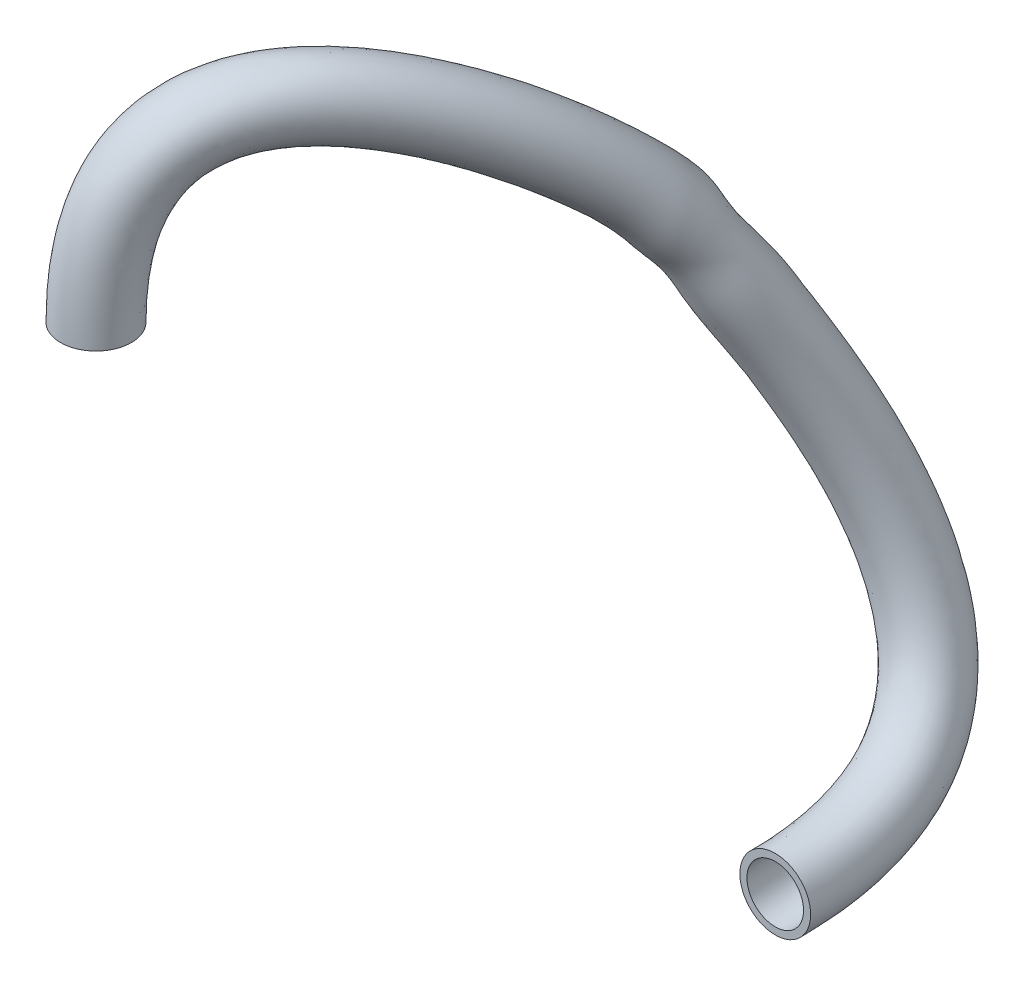
ISO-10303-21;
HEADER;
FILE_DESCRIPTION(('STEP AP214'),'2;1');
FILE_NAME('part.step','',(''),(''),'','','');
FILE_SCHEMA(('AUTOMOTIVE_DESIGN { 1 0 10303 214 1 1 1 1 }'));
ENDSEC;
DATA;
#1=APPLICATION_CONTEXT('core data for automotive mechanical design processes');
#2=APPLICATION_PROTOCOL_DEFINITION('international standard','automotive_design',2000,#1);
#3=PRODUCT_CONTEXT('',#1,'mechanical');
#4=PRODUCT('Part','Part','',(#3));
#5=PRODUCT_RELATED_PRODUCT_CATEGORY('part','',(#4));
#6=PRODUCT_DEFINITION_FORMATION('','',#4);
#7=PRODUCT_DEFINITION_CONTEXT('part definition',#1,'design');
#8=PRODUCT_DEFINITION('design','',#6,#7);
#9=PRODUCT_DEFINITION_SHAPE('','',#8);
#10=(LENGTH_UNIT() NAMED_UNIT(*) SI_UNIT(.MILLI.,.METRE.));
#11=(NAMED_UNIT(*) PLANE_ANGLE_UNIT() SI_UNIT($,.RADIAN.));
#12=(NAMED_UNIT(*) SI_UNIT($,.STERADIAN.) SOLID_ANGLE_UNIT());
#13=UNCERTAINTY_MEASURE_WITH_UNIT(LENGTH_MEASURE(1.E-05),#10,'distance_accuracy_value','');
#14=(GEOMETRIC_REPRESENTATION_CONTEXT(3) GLOBAL_UNCERTAINTY_ASSIGNED_CONTEXT((#13)) GLOBAL_UNIT_ASSIGNED_CONTEXT((#10,
#11,#12)) REPRESENTATION_CONTEXT('',''));
#15=CARTESIAN_POINT('',(0.,0.,0.));
#16=DIRECTION('',(0.,0.,1.));
#17=DIRECTION('',(1.,0.,0.));
#18=AXIS2_PLACEMENT_3D('',#15,#16,#17);
#19=CARTESIAN_POINT('',(14.,-15.5,-9.99999999999995));
#20=DIRECTION('',(0.,0.,1.));
#21=DIRECTION('',(0.789083973003647,-0.614285343752218,0.));
#22=AXIS2_PLACEMENT_3D('',#19,#20,#21);
#23=PLANE('',#22);
#24=CARTESIAN_POINT('',(14.,-15.5,-9.99999999999995));
#25=DIRECTION('',(0.,0.,1.));
#26=DIRECTION('',(0.789083973003647,-0.614285343752218,0.));
#27=AXIS2_PLACEMENT_3D('',#24,#25,#26);
#28=CIRCLE('',#27,1.);
#29=CARTESIAN_POINT('',(14.7890839730036,-16.1142853437522,-9.99999999999994));
#30=VERTEX_POINT('',#29);
#31=EDGE_CURVE('E397',#30,#30,#28,.T.);
#32=ORIENTED_EDGE('',*,*,#31,.F.);
#33=EDGE_LOOP('',(#32));
#34=FACE_BOUND('',#33,.T.);
#35=CARTESIAN_POINT('',(14.,-15.5,-9.99999999999995));
#36=DIRECTION('',(0.,0.,1.));
#37=DIRECTION('',(0.789083973003647,-0.614285343752218,0.));
#38=AXIS2_PLACEMENT_3D('',#35,#36,#37);
#39=CIRCLE('',#38,1.25);
#40=CARTESIAN_POINT('',(14.9863549662545,-16.2678566796903,-9.99999999999994));
#41=VERTEX_POINT('',#40);
#42=EDGE_CURVE('E12',#41,#41,#39,.T.);
#43=ORIENTED_EDGE('',*,*,#42,.T.);
#44=EDGE_LOOP('',(#43));
#45=FACE_BOUND('',#44,.T.);
#46=ADVANCED_FACE('F387',(#34,#45),#23,.T.);
#47=CARTESIAN_POINT('',(0.,0.,0.));
#48=DIRECTION('',(0.,1.,0.));
#49=DIRECTION('',(0.,0.,1.));
#50=AXIS2_PLACEMENT_3D('',#47,#48,#49);
#51=PLANE('',#50);
#52=CARTESIAN_POINT('',(0.,0.,0.));
#53=DIRECTION('',(0.,1.,0.));
#54=DIRECTION('',(0.,0.,1.));
#55=AXIS2_PLACEMENT_3D('',#52,#53,#54);
#56=CIRCLE('',#55,1.);
#57=CARTESIAN_POINT('',(0.,0.,1.));
#58=VERTEX_POINT('',#57);
#59=EDGE_CURVE('E416',#58,#58,#56,.T.);
#60=ORIENTED_EDGE('',*,*,#59,.T.);
#61=EDGE_LOOP('',(#60));
#62=FACE_BOUND('',#61,.T.);
#63=CARTESIAN_POINT('',(0.,0.,0.));
#64=DIRECTION('',(0.,1.,0.));
#65=DIRECTION('',(0.,0.,1.));
#66=AXIS2_PLACEMENT_3D('',#63,#64,#65);
#67=CIRCLE('',#66,1.25);
#68=CARTESIAN_POINT('',(0.,0.,1.25));
#69=VERTEX_POINT('',#68);
#70=EDGE_CURVE('E420',#69,#69,#67,.T.);
#71=ORIENTED_EDGE('',*,*,#70,.F.);
#72=EDGE_LOOP('',(#71));
#73=FACE_BOUND('',#72,.T.);
#74=ADVANCED_FACE('F432',(#62,#73),#51,.F.);
#75=CARTESIAN_POINT('',(0.,0.,1.25));
#76=CARTESIAN_POINT('',(0.000443159797817283,0.600432614982434,1.24900960001782));
#77=CARTESIAN_POINT('',(0.0311438299072186,1.70824203480459,1.19527922970763));
#78=CARTESIAN_POINT('',(0.172108050697637,3.15001153602846,0.950047574269966));
#79=CARTESIAN_POINT('',(0.387865478221217,4.2771495488151,0.575264200533966));
#80=CARTESIAN_POINT('',(0.65473647429474,5.14867232651583,0.112071346721281));
#81=CARTESIAN_POINT('',(0.947192517956339,5.80559858182057,-0.395256930318224));
#82=CARTESIAN_POINT('',(1.28423247697856,6.32445185948775,-0.979659325308274));
#83=CARTESIAN_POINT('',(1.77693727554934,6.82713809198644,-1.833655684593));
#84=CARTESIAN_POINT('',(2.44043443387204,7.11869980432711,-2.98305764842713));
#85=CARTESIAN_POINT('',(3.25559449789904,7.06206211016763,-4.39493210630585));
#86=CARTESIAN_POINT('',(4.074153277781,6.71295581559429,-5.81133675757498));
#87=CARTESIAN_POINT('',(5.21386823932525,5.91552908532776,-7.79081468461486));
#88=CARTESIAN_POINT('',(6.62441283422166,4.43784721036875,-10.1969261045626));
#89=CARTESIAN_POINT('',(7.44977058523145,3.15429014822095,-11.7844069540515));
#90=CARTESIAN_POINT('',(8.16477577719259,2.05687583284689,-12.8753265309124));
#91=CARTESIAN_POINT('',(8.59787514451698,1.36132699933438,-13.373649716726));
#92=CARTESIAN_POINT('',(8.37636995382083,0.370275762379769,-14.2718001755615));
#93=CARTESIAN_POINT('',(8.27905558322766,-0.972530647124541,-15.3682116993445));
#94=CARTESIAN_POINT('',(9.82371979772082,-3.18924197608111,-16.2542848622035));
#95=CARTESIAN_POINT('',(10.7839132195536,-5.97221141947634,-17.4402366823719));
#96=CARTESIAN_POINT('',(11.7491475828968,-8.290393669503,-17.9960993735494));
#97=CARTESIAN_POINT('',(12.4654845221077,-10.068813081878,-18.1754493505048));
#98=CARTESIAN_POINT('',(13.0701186004497,-11.5560016181267,-18.0193147739162));
#99=CARTESIAN_POINT('',(13.5490318024737,-12.736076883405,-17.6147652043025));
#100=CARTESIAN_POINT('',(13.9084304398311,-13.6207299344259,-17.1070974446474));
#101=CARTESIAN_POINT('',(14.2314354189671,-14.4153874385595,-16.3995861882586));
#102=CARTESIAN_POINT('',(14.5042996756602,-15.0861383922094,-15.4945219768148));
#103=CARTESIAN_POINT('',(14.7187059968212,-15.612702942376,-14.4040934545537));
#104=CARTESIAN_POINT('',(14.8722505107489,-15.9893254782395,-13.1356568613964));
#105=CARTESIAN_POINT('',(14.9653099183771,-16.2170975925243,-11.6825325410541));
#106=CARTESIAN_POINT('',(14.9859255166746,-16.2671126919445,-10.58685250763));
#107=CARTESIAN_POINT('',(14.9863549662546,-16.2678566796903,-9.99999999999992));
#108=CARTESIAN_POINT('',(-2.5,0.,1.25));
#109=CARTESIAN_POINT('',(-2.49889937425142,0.647989125137163,1.24761359768785));
#110=CARTESIAN_POINT('',(-2.4668837722405,1.85091156526878,1.19109122271773));
#111=CARTESIAN_POINT('',(-2.30844009070488,3.48309620995854,0.91475390825515));
#112=CARTESIAN_POINT('',(-2.05455331666513,4.81810933820954,0.473112173350324));
#113=CARTESIAN_POINT('',(-1.72655610028666,5.89203332739887,-0.0967423924698728));
#114=CARTESIAN_POINT('',(-1.35743439539171,6.72214911622659,-0.73759541636114));
#115=CARTESIAN_POINT('',(-0.927062225836374,7.38435792485332,-1.48441349372848));
#116=CARTESIAN_POINT('',(-0.301111082320269,8.0211143985897,-2.57026974025606));
#117=CARTESIAN_POINT('',(0.516383262294226,8.37223407003032,-3.98799802000307));
#118=CARTESIAN_POINT('',(1.46128809312117,8.29729094540743,-5.62759986732182));
#119=CARTESIAN_POINT('',(2.36709082972953,7.902727284087,-7.20055175718432));
#120=CARTESIAN_POINT('',(3.58662056870041,7.02772943455003,-9.32980582876691));
#121=CARTESIAN_POINT('',(5.06058079345582,5.46278752988492,-11.8877088470656));
#122=CARTESIAN_POINT('',(5.83686255106693,4.01094040536335,-13.4344947800626));
#123=CARTESIAN_POINT('',(6.62101991585282,2.82117785019294,-14.7547364329108));
#124=CARTESIAN_POINT('',(7.15889812996085,2.07825567469364,-15.554358975196));
#125=CARTESIAN_POINT('',(6.38112861261878,0.264778695834172,-15.4919630148561));
#126=CARTESIAN_POINT('',(5.6858142347917,-1.88023604397857,-15.5640533410813));
#127=CARTESIAN_POINT('',(7.70728695017192,-3.38612243001059,-17.5947248010407));
#128=CARTESIAN_POINT('',(8.6060654349124,-6.4640610293508,-18.5718670431698));
#129=CARTESIAN_POINT('',(9.65826823176036,-8.90782078825622,-19.2227108235649));
#130=CARTESIAN_POINT('',(10.4466964659898,-10.8699358023006,-19.4208861223505));
#131=CARTESIAN_POINT('',(11.1453289562584,-12.5812536434253,-19.251708987618));
#132=CARTESIAN_POINT('',(11.7202301964145,-13.995986247747,-18.7704193952943));
#133=CARTESIAN_POINT('',(12.1612584565046,-15.0800573366071,-18.1507842583149));
#134=CARTESIAN_POINT('',(12.5605472166317,-16.0612370881549,-17.2782654641548));
#135=CARTESIAN_POINT('',(12.8937637320378,-16.8792906678598,-16.1733483735124));
#136=CARTESIAN_POINT('',(13.1482988330897,-17.5034133983972,-14.8776264198416));
#137=CARTESIAN_POINT('',(13.3242637842605,-17.9340436679777,-13.4223217799363));
#138=CARTESIAN_POINT('',(13.4277590014835,-18.1863683261242,-11.808434402019));
#139=CARTESIAN_POINT('',(13.449599638123,-18.2386762248172,-10.6288197946183));
#140=CARTESIAN_POINT('',(13.450641606874,-18.2405666121994,-9.99999999999991));
#141=CARTESIAN_POINT('',(-2.5,0.,-1.25));
#142=CARTESIAN_POINT('',(-2.49978569384706,0.56542843298809,-1.25040560234779));
#143=CARTESIAN_POINT('',(-2.4695427310274,1.60322948882155,-1.3029663773892));
#144=CARTESIAN_POINT('',(-2.34066940332165,2.90460339553119,-1.5266464567897));
#145=CARTESIAN_POINT('',(-2.15227059866531,3.87828217907819,-1.85344287890481));
#146=CARTESIAN_POINT('',(-1.92976258548091,4.60015332830115,-2.23921671809532));
#147=CARTESIAN_POINT('',(-1.69319099405263,5.12874336635376,-2.64920641235525));
#148=CARTESIAN_POINT('',(-1.42434009872335,5.54090503045819,-3.1149444540686));
#149=CARTESIAN_POINT('',(-1.02910852575782,5.94281090163018,-3.79930007873528));
#150=CARTESIAN_POINT('',(-0.478443258830474,6.1867877790496,-4.75223231803015));
#151=CARTESIAN_POINT('',(0.241321709147487,6.13601676400761,-5.99602544699452));
#152=CARTESIAN_POINT('',(0.99426677895588,5.80947705784494,-7.29694127108048));
#153=CARTESIAN_POINT('',(2.07273591904288,5.03888698114728,-9.1495933141251));
#154=CARTESIAN_POINT('',(3.40733165052187,3.59871494245321,-11.4945472342134));
#155=CARTESIAN_POINT('',(4.27296363027447,2.20635780883425,-12.8135467771453));
#156=CARTESIAN_POINT('',(4.82887283026031,1.19774288144875,-13.9504410592704));
#157=CARTESIAN_POINT('',(5.04320982075595,0.665076856385629,-14.6187605696505));
#158=CARTESIAN_POINT('',(5.41312277770412,-1.02666401248296,-13.7870381147185));
#159=CARTESIAN_POINT('',(5.93584457747973,-3.12299466755062,-13.1246103954002));
#160=CARTESIAN_POINT('',(6.63944540653696,-4.67025091396364,-15.7126740218722));
#161=CARTESIAN_POINT('',(7.76097997594678,-7.53054530339216,-16.4671303777481));
#162=CARTESIAN_POINT('',(8.64189719588144,-9.70622031040905,-17.0765177210036));
#163=CARTESIAN_POINT('',(9.30839861060821,-11.3576851310056,-17.2369491187045));
#164=CARTESIAN_POINT('',(9.84329769733056,-12.6785696977009,-17.1022028898235));
#165=CARTESIAN_POINT('',(10.2522142432538,-13.6875665515043,-16.7574404453483));
#166=CARTESIAN_POINT('',(10.5520093477935,-14.4266290599819,-16.3346671774815));
#167=CARTESIAN_POINT('',(10.8194398303304,-15.0854172417957,-15.750235494615));
#168=CARTESIAN_POINT('',(11.0484791151594,-15.6492201595348,-14.9934349841328));
#169=CARTESIAN_POINT('',(11.2339644994342,-16.1054947317963,-14.0548671010616));
#170=CARTESIAN_POINT('',(11.3716270316408,-16.4438924583573,-12.9244268523968));
#171=CARTESIAN_POINT('',(11.4576257664542,-16.6551188932182,-11.5898588089878));
#172=CARTESIAN_POINT('',(11.4777486047738,-16.7044508409282,-10.5559612636079));
#173=CARTESIAN_POINT('',(11.4779316743649,-16.7048532528188,-9.99999999999994));
#174=CARTESIAN_POINT('',(0.,0.,-1.25));
#175=CARTESIAN_POINT('',(-0.000443159797817134,0.517871922833361,-1.24900960001782));
#176=CARTESIAN_POINT('',(0.028484871120315,1.46055995835736,-1.2987783703993));
#177=CARTESIAN_POINT('',(0.139878738080873,2.57151872160111,-1.49135279077489));
#178=CARTESIAN_POINT('',(0.290148196221044,3.33732238968375,-1.75129085172117));
#179=CARTESIAN_POINT('',(0.451529989100484,3.85679232741811,-2.03040297890417));
#180=CARTESIAN_POINT('',(0.611435919295422,4.21219283194774,-2.30686792631234));
#181=CARTESIAN_POINT('',(0.78695460409159,4.48099896509264,-2.61019028564839));
#182=CARTESIAN_POINT('',(1.04893983211178,4.74883459502692,-3.06268602307222));
#183=CARTESIAN_POINT('',(1.44560791274734,4.9332535133464,-3.74729194645421));
#184=CARTESIAN_POINT('',(2.03562811392535,4.90078792876781,-4.76335768597856));
#185=CARTESIAN_POINT('',(2.70132922700736,4.61970558935223,-5.90772627147114));
#186=CARTESIAN_POINT('',(3.69998358966772,3.92668663192501,-7.61060216997305));
#187=CARTESIAN_POINT('',(4.97116369128772,2.57377462293705,-9.80376449171041));
#188=CARTESIAN_POINT('',(5.885871664439,1.34970755169185,-11.1634589511342));
#189=CARTESIAN_POINT('',(6.37262869160007,0.433440864102697,-12.071031157272));
#190=CARTESIAN_POINT('',(6.48218683531208,-0.0518518189736274,-12.4380513111805));
#191=CARTESIAN_POINT('',(7.40836411890617,-0.921166945937365,-12.5668752754239));
#192=CARTESIAN_POINT('',(8.52908592591569,-2.2152892706966,-12.9287687536634));
#193=CARTESIAN_POINT('',(8.75587825408587,-4.47337046003416,-14.3722340830349));
#194=CARTESIAN_POINT('',(9.93882776058795,-7.0386956935177,-15.3355000169502));
#195=CARTESIAN_POINT('',(10.7327765470179,-9.08879319165583,-15.849906270988));
#196=CARTESIAN_POINT('',(11.3271866667261,-10.556562410583,-15.9915123468589));
#197=CARTESIAN_POINT('',(11.7680873415218,-11.6533176724023,-15.8698086761218));
#198=CARTESIAN_POINT('',(12.0810158493129,-12.4276571871623,-15.6017862543565));
#199=CARTESIAN_POINT('',(12.29918133112,-12.9673016578008,-15.290980363814));
#200=CARTESIAN_POINT('',(12.4903280326657,-13.4395675922004,-14.8715562187187));
#201=CARTESIAN_POINT('',(12.6590150587817,-13.8560678838844,-14.3146085874352));
#202=CARTESIAN_POINT('',(12.8043716631658,-14.214784275775,-13.5813341357737));
#203=CARTESIAN_POINT('',(12.9196137581292,-14.4991742686191,-12.6377619338569));
#204=CARTESIAN_POINT('',(12.9951766833479,-14.6858481596183,-11.4639569480229));
#205=CARTESIAN_POINT('',(13.0140744833254,-14.7328873080555,-10.5139939766196));
#206=CARTESIAN_POINT('',(13.0136450337454,-14.7321433203097,-9.99999999999995));
#207=CARTESIAN_POINT('',(2.5,0.,-1.25));
#208=CARTESIAN_POINT('',(2.49889937425142,0.470315412678631,-1.24761359768785));
#209=CARTESIAN_POINT('',(2.52651247326803,1.31789042789317,-1.2945903634094));
#210=CARTESIAN_POINT('',(2.62042687948339,2.23843404767103,-1.45605912476007));
#211=CARTESIAN_POINT('',(2.73256699110739,2.79636260028931,-1.64913882453753));
#212=CARTESIAN_POINT('',(2.83282256368188,3.11343132653507,-1.82158923971301));
#213=CARTESIAN_POINT('',(2.91606283264347,3.29564229754171,-1.96452944026942));
#214=CARTESIAN_POINT('',(2.99824930690653,3.42109289972708,-2.10543611722819));
#215=CARTESIAN_POINT('',(3.12698818998139,3.55485828842367,-2.32607196740916));
#216=CARTESIAN_POINT('',(3.36965908432515,3.67971924764319,-2.74235157487828));
#217=CARTESIAN_POINT('',(3.82993451870322,3.66555909352801,-3.53068992496259));
#218=CARTESIAN_POINT('',(4.40839167505883,3.42993412085952,-4.51851127186179));
#219=CARTESIAN_POINT('',(5.32723126029256,2.81448628270275,-6.071611025821));
#220=CARTESIAN_POINT('',(6.53499573205356,1.54883430342088,-8.11298174920746));
#221=CARTESIAN_POINT('',(7.49877969860352,0.493057294549447,-9.51337112512315));
#222=CARTESIAN_POINT('',(7.91638455293984,-0.330861153243358,-10.1916212552735));
#223=CARTESIAN_POINT('',(7.92116384986822,-0.768780494332884,-10.2573420527105));
#224=CARTESIAN_POINT('',(9.40360546010822,-0.815669879391768,-11.3467124361293));
#225=CARTESIAN_POINT('',(11.1223272743516,-1.30758387384257,-12.7329271119266));
#226=CARTESIAN_POINT('',(10.8723111016348,-4.27649000610469,-13.0317941441977));
#227=CARTESIAN_POINT('',(12.1166755452291,-6.54684608364324,-14.2038696561523));
#228=CARTESIAN_POINT('',(12.8236558981544,-8.47136607290261,-14.6232948209725));
#229=CARTESIAN_POINT('',(13.3459747228441,-9.75543969016039,-14.7460755750133));
#230=CARTESIAN_POINT('',(13.6928769857131,-10.6280656471037,-14.63741446242));
#231=CARTESIAN_POINT('',(13.9098174553721,-11.1677478228203,-14.4461320633647));
#232=CARTESIAN_POINT('',(14.0463533144465,-11.5079742556196,-14.2472935501465));
#233=CARTESIAN_POINT('',(14.1612162350011,-11.7937179426051,-13.9928769428224));
#234=CARTESIAN_POINT('',(14.2695510024041,-12.062915608234,-13.6357821907376));
#235=CARTESIAN_POINT('',(14.3747788268973,-12.3240738197538,-13.1078011704857));
#236=CARTESIAN_POINT('',(14.4676004846176,-12.5544560788809,-12.351097015317));
#237=CARTESIAN_POINT('',(14.5327276002416,-12.7165774260183,-11.3380550870579));
#238=CARTESIAN_POINT('',(14.550400361877,-12.7613237751828,-10.4720266896313));
#239=CARTESIAN_POINT('',(14.549358393126,-12.7594333878006,-9.99999999999997));
#240=CARTESIAN_POINT('',(2.5,0.,1.25));
#241=CARTESIAN_POINT('',(2.49978569384706,0.552876104827705,1.25040560234779));
#242=CARTESIAN_POINT('',(2.52917143205494,1.5655725043404,1.19946723669754));
#243=CARTESIAN_POINT('',(2.65265619210016,2.81692686209838,0.985341240284782));
#244=CARTESIAN_POINT('',(2.83028427310757,3.73618975942066,0.677416227717608));
#245=CARTESIAN_POINT('',(3.03602904887614,4.40531132563279,0.320885085912436));
#246=CARTESIAN_POINT('',(3.25181943130439,4.88904804741455,-0.0529184442753082));
#247=CARTESIAN_POINT('',(3.4955271797935,5.2645457941222,-0.474905156888071));
#248=CARTESIAN_POINT('',(3.85498563341895,5.63316178538318,-1.09704162892993));
#249=CARTESIAN_POINT('',(4.36448560544985,5.86516553862391,-1.9781172768512));
#250=CARTESIAN_POINT('',(5.0499009026769,5.82683327492782,-3.16226434528988));
#251=CARTESIAN_POINT('',(5.78121572583248,5.52318434710158,-4.42212175796563));
#252=CARTESIAN_POINT('',(6.84111590995009,4.8033287361055,-6.25182354046281));
#253=CARTESIAN_POINT('',(8.1882448749875,3.41290689085259,-8.50614336205967));
#254=CARTESIAN_POINT('',(9.06267861939598,2.29763989107855,-10.1343191280404));
#255=CARTESIAN_POINT('',(9.70853163853235,1.29257381550083,-10.995916628914));
#256=CARTESIAN_POINT('',(10.0368521590731,0.644398323975125,-11.192940458256));
#257=CARTESIAN_POINT('',(10.3716112950229,0.475772828925366,-13.0516373362669));
#258=CARTESIAN_POINT('',(10.8722969316636,-0.0648252502705152,-15.1723700576077));
#259=CARTESIAN_POINT('',(11.9401526452697,-2.99236152215164,-14.9138449233663));
#260=CARTESIAN_POINT('',(12.9617610041947,-5.48036180960188,-16.308606321574));
#261=CARTESIAN_POINT('',(13.8400269340333,-7.67296655074978,-16.7694879235338));
#262=CARTESIAN_POINT('',(14.4842725782257,-9.26769036145542,-16.9300125786592));
#263=CARTESIAN_POINT('',(14.994908244641,-10.5307495928281,-16.7869205602145));
#264=CARTESIAN_POINT('',(15.3778334085329,-11.4761675190629,-16.4591110133106));
#265=CARTESIAN_POINT('',(15.6556024231576,-12.1614025322448,-16.0634106309799));
#266=CARTESIAN_POINT('',(15.9023236213024,-12.7695377889642,-15.5209069123623));
#267=CARTESIAN_POINT('',(16.1148356192826,-13.292986116559,-14.8156955801171));
#268=CARTESIAN_POINT('',(16.2891131605528,-13.7219924863547,-13.9305604892658));
#269=CARTESIAN_POINT('',(16.4202372372373,-14.0446072885013,-12.8489919428565));
#270=CARTESIAN_POINT('',(16.5028608352708,-14.2478268589244,-11.5566306800891));
#271=CARTESIAN_POINT('',(16.5222513952262,-14.2955491590718,-10.5448852206417));
#272=CARTESIAN_POINT('',(16.5220683256351,-14.2951467471812,-9.99999999999994));
#273=CARTESIAN_POINT('',(0.,0.,1.25));
#274=CARTESIAN_POINT('',(0.000443159797817283,0.600432614982434,1.24900960001782));
#275=CARTESIAN_POINT('',(0.0311438299072186,1.70824203480459,1.19527922970763));
#276=CARTESIAN_POINT('',(0.172108050697637,3.15001153602846,0.950047574269966));
#277=CARTESIAN_POINT('',(0.387865478221217,4.2771495488151,0.575264200533966));
#278=CARTESIAN_POINT('',(0.65473647429474,5.14867232651583,0.112071346721281));
#279=CARTESIAN_POINT('',(0.947192517956339,5.80559858182057,-0.395256930318224));
#280=CARTESIAN_POINT('',(1.28423247697856,6.32445185948775,-0.979659325308274));
#281=CARTESIAN_POINT('',(1.77693727554934,6.82713809198644,-1.833655684593));
#282=CARTESIAN_POINT('',(2.44043443387204,7.11869980432711,-2.98305764842713));
#283=CARTESIAN_POINT('',(3.25559449789904,7.06206211016763,-4.39493210630585));
#284=CARTESIAN_POINT('',(4.074153277781,6.71295581559429,-5.81133675757498));
#285=CARTESIAN_POINT('',(5.21386823932525,5.91552908532776,-7.79081468461486));
#286=CARTESIAN_POINT('',(6.62441283422166,4.43784721036875,-10.1969261045626));
#287=CARTESIAN_POINT('',(7.44977058523145,3.15429014822095,-11.7844069540515));
#288=CARTESIAN_POINT('',(8.16477577719259,2.05687583284689,-12.8753265309124));
#289=CARTESIAN_POINT('',(8.59787514451698,1.36132699933438,-13.373649716726));
#290=CARTESIAN_POINT('',(8.37636995382083,0.370275762379769,-14.2718001755615));
#291=CARTESIAN_POINT('',(8.27905558322766,-0.972530647124541,-15.3682116993445));
#292=CARTESIAN_POINT('',(9.82371979772082,-3.18924197608111,-16.2542848622035));
#293=CARTESIAN_POINT('',(10.7839132195536,-5.97221141947634,-17.4402366823719));
#294=CARTESIAN_POINT('',(11.7491475828968,-8.290393669503,-17.9960993735494));
#295=CARTESIAN_POINT('',(12.4654845221077,-10.068813081878,-18.1754493505048));
#296=CARTESIAN_POINT('',(13.0701186004497,-11.5560016181267,-18.0193147739162));
#297=CARTESIAN_POINT('',(13.5490318024737,-12.736076883405,-17.6147652043025));
#298=CARTESIAN_POINT('',(13.9084304398311,-13.6207299344259,-17.1070974446474));
#299=CARTESIAN_POINT('',(14.2314354189671,-14.4153874385595,-16.3995861882586));
#300=CARTESIAN_POINT('',(14.5042996756602,-15.0861383922094,-15.4945219768148));
#301=CARTESIAN_POINT('',(14.7187059968212,-15.612702942376,-14.4040934545537));
#302=CARTESIAN_POINT('',(14.8722505107489,-15.9893254782395,-13.1356568613964));
#303=CARTESIAN_POINT('',(14.9653099183771,-16.2170975925243,-11.6825325410541));
#304=CARTESIAN_POINT('',(14.9859255166746,-16.2671126919445,-10.58685250763));
#305=CARTESIAN_POINT('',(14.9863549662546,-16.2678566796903,-9.99999999999992));
#306=(BOUNDED_SURFACE() B_SPLINE_SURFACE(3,3,((#75,#76,#77,#78,#79,#80,#81,#82,#83,#84,#85,#86,
#87,#88,#89,#90,#91,#92,#93,#94,#95,#96,#97,#98,#99,#100,#101,#102,#103,#104,#105,#106,#107),
(#108,#109,#110,#111,#112,#113,#114,#115,#116,#117,#118,#119,#120,#121,#122,#123,#124,#125,#126,
#127,#128,#129,#130,#131,#132,#133,#134,#135,#136,#137,#138,#139,#140),(#141,#142,#143,#144,
#145,#146,#147,#148,#149,#150,#151,#152,#153,#154,#155,#156,#157,#158,#159,#160,#161,#162,#163,
#164,#165,#166,#167,#168,#169,#170,#171,#172,#173),(#174,#175,#176,#177,#178,#179,#180,#181,
#182,#183,#184,#185,#186,#187,#188,#189,#190,#191,#192,#193,#194,#195,#196,#197,#198,#199,#200,
#201,#202,#203,#204,#205,#206),(#207,#208,#209,#210,#211,#212,#213,#214,#215,#216,#217,#218,
#219,#220,#221,#222,#223,#224,#225,#226,#227,#228,#229,#230,#231,#232,#233,#234,#235,#236,#237,
#238,#239),(#240,#241,#242,#243,#244,#245,#246,#247,#248,#249,#250,#251,#252,#253,#254,#255,
#256,#257,#258,#259,#260,#261,#262,#263,#264,#265,#266,#267,#268,#269,#270,#271,#272),(#273,
#274,#275,#276,#277,#278,#279,#280,#281,#282,#283,#284,#285,#286,#287,#288,#289,#290,#291,#292,
#293,#294,#295,#296,#297,#298,#299,#300,#301,#302,#303,#304,#305)),.UNSPECIFIED.,.T.,.F.,
.F.) B_SPLINE_SURFACE_WITH_KNOTS((4,3,4),(4,1,1,1,1,1,1,1,1,1,1,1,1,1,1,1,1,1,1,1,1,1,1,1,1,1,1,
1,1,1,4),(0.,0.5,1.),(0.,0.0208333333333323,0.0416666666666666,0.0625,0.0781249999999999,
0.09375,0.109375,0.125,0.15625,0.1875,0.21875,0.25,0.3203125,0.390625,0.394973665371374,
0.4609375,0.494973665371374,0.53125,0.610000000000001,0.68875,0.73,0.77125,0.8125,
0.835937499999999,0.859375,0.8828125,0.90625,0.929687500000087,0.953125,0.9765625,1.),
.UNSPECIFIED.) GEOMETRIC_REPRESENTATION_ITEM() RATIONAL_B_SPLINE_SURFACE(((1.,1.,1.,1.,1.,1.,1.,
1.,1.,1.,1.,1.,1.,1.,1.,1.,1.,1.,1.,1.,1.,1.,1.,1.,1.,1.,1.,1.,1.,1.,1.,1.,1.),
(0.333333333333333,0.333333333333333,0.333333333333333,0.333333333333333,0.333333333333333,
0.333333333333333,0.333333333333333,0.333333333333333,0.333333333333333,0.333333333333333,
0.333333333333333,0.333333333333333,0.333333333333333,0.333333333333333,0.333333333333333,
0.333333333333333,0.333333333333333,0.333333333333333,0.333333333333333,0.333333333333333,
0.333333333333333,0.333333333333333,0.333333333333333,0.333333333333333,0.333333333333333,
0.333333333333333,0.333333333333333,0.333333333333333,0.333333333333333,0.333333333333333,
0.333333333333333,0.333333333333333,0.333333333333333),(0.333333333333333,0.333333333333333,
0.333333333333333,0.333333333333333,0.333333333333333,0.333333333333333,0.333333333333333,
0.333333333333333,0.333333333333333,0.333333333333333,0.333333333333333,0.333333333333333,
0.333333333333333,0.333333333333333,0.333333333333333,0.333333333333333,0.333333333333333,
0.333333333333333,0.333333333333333,0.333333333333333,0.333333333333333,0.333333333333333,
0.333333333333333,0.333333333333333,0.333333333333333,0.333333333333333,0.333333333333333,
0.333333333333333,0.333333333333333,0.333333333333333,0.333333333333333,0.333333333333333,
0.333333333333333),(1.,1.,1.,1.,1.,1.,1.,1.,1.,1.,1.,1.,1.,1.,1.,1.,1.,1.,1.,1.,1.,1.,1.,1.,1.,
1.,1.,1.,1.,1.,1.,1.,1.),(0.333333333333333,0.333333333333333,0.333333333333333,
0.333333333333333,0.333333333333333,0.333333333333333,0.333333333333333,0.333333333333333,
0.333333333333333,0.333333333333333,0.333333333333333,0.333333333333333,0.333333333333333,
0.333333333333333,0.333333333333333,0.333333333333333,0.333333333333333,0.333333333333333,
0.333333333333333,0.333333333333333,0.333333333333333,0.333333333333333,0.333333333333333,
0.333333333333333,0.333333333333333,0.333333333333333,0.333333333333333,0.333333333333333,
0.333333333333333,0.333333333333333,0.333333333333333,0.333333333333333,0.333333333333333),
(0.333333333333333,0.333333333333333,0.333333333333333,0.333333333333333,0.333333333333333,
0.333333333333333,0.333333333333333,0.333333333333333,0.333333333333333,0.333333333333333,
0.333333333333333,0.333333333333333,0.333333333333333,0.333333333333333,0.333333333333333,
0.333333333333333,0.333333333333333,0.333333333333333,0.333333333333333,0.333333333333333,
0.333333333333333,0.333333333333333,0.333333333333333,0.333333333333333,0.333333333333333,
0.333333333333333,0.333333333333333,0.333333333333333,0.333333333333333,0.333333333333333,
0.333333333333333,0.333333333333333,0.333333333333333),(1.,1.,1.,1.,1.,1.,1.,1.,1.,1.,1.,1.,1.,
1.,1.,1.,1.,1.,1.,1.,1.,1.,1.,1.,1.,1.,1.,1.,1.,1.,1.,1.,1.))) REPRESENTATION_ITEM('') SURFACE());
#307=CARTESIAN_POINT('',(0.,0.,1.25));
#308=CARTESIAN_POINT('',(0.000443159797817283,0.600432614982434,1.24900960001782));
#309=CARTESIAN_POINT('',(0.0311438299072186,1.70824203480459,1.19527922970763));
#310=CARTESIAN_POINT('',(0.172108050697637,3.15001153602846,0.950047574269966));
#311=CARTESIAN_POINT('',(0.387865478221217,4.2771495488151,0.575264200533966));
#312=CARTESIAN_POINT('',(0.65473647429474,5.14867232651583,0.112071346721281));
#313=CARTESIAN_POINT('',(0.947192517956339,5.80559858182057,-0.395256930318224));
#314=CARTESIAN_POINT('',(1.28423247697856,6.32445185948775,-0.979659325308274));
#315=CARTESIAN_POINT('',(1.77693727554934,6.82713809198644,-1.833655684593));
#316=CARTESIAN_POINT('',(2.44043443387204,7.11869980432711,-2.98305764842713));
#317=CARTESIAN_POINT('',(3.25559449789904,7.06206211016763,-4.39493210630585));
#318=CARTESIAN_POINT('',(4.074153277781,6.71295581559429,-5.81133675757498));
#319=CARTESIAN_POINT('',(5.21386823932525,5.91552908532776,-7.79081468461486));
#320=CARTESIAN_POINT('',(6.62441283422166,4.43784721036875,-10.1969261045626));
#321=CARTESIAN_POINT('',(7.44977058523145,3.15429014822095,-11.7844069540515));
#322=CARTESIAN_POINT('',(8.16477577719259,2.05687583284689,-12.8753265309124));
#323=CARTESIAN_POINT('',(8.59787514451698,1.36132699933438,-13.373649716726));
#324=CARTESIAN_POINT('',(8.37636995382083,0.370275762379769,-14.2718001755615));
#325=CARTESIAN_POINT('',(8.27905558322766,-0.972530647124541,-15.3682116993445));
#326=CARTESIAN_POINT('',(9.82371979772082,-3.18924197608111,-16.2542848622035));
#327=CARTESIAN_POINT('',(10.7839132195536,-5.97221141947634,-17.4402366823719));
#328=CARTESIAN_POINT('',(11.7491475828968,-8.290393669503,-17.9960993735494));
#329=CARTESIAN_POINT('',(12.4654845221077,-10.068813081878,-18.1754493505048));
#330=CARTESIAN_POINT('',(13.0701186004497,-11.5560016181267,-18.0193147739162));
#331=CARTESIAN_POINT('',(13.5490318024737,-12.736076883405,-17.6147652043025));
#332=CARTESIAN_POINT('',(13.9084304398311,-13.6207299344259,-17.1070974446474));
#333=CARTESIAN_POINT('',(14.2314354189671,-14.4153874385595,-16.3995861882586));
#334=CARTESIAN_POINT('',(14.5042996756602,-15.0861383922094,-15.4945219768148));
#335=CARTESIAN_POINT('',(14.7187059968212,-15.612702942376,-14.4040934545537));
#336=CARTESIAN_POINT('',(14.8722505107489,-15.9893254782395,-13.1356568613964));
#337=CARTESIAN_POINT('',(14.9653099183771,-16.2170975925243,-11.6825325410541));
#338=CARTESIAN_POINT('',(14.9859255166746,-16.2671126919445,-10.58685250763));
#339=CARTESIAN_POINT('',(14.9863549662546,-16.2678566796903,-9.99999999999992));
#340=B_SPLINE_CURVE_WITH_KNOTS('',3,(#307,#308,#309,#310,#311,#312,#313,#314,#315,#316,#317,
#318,#319,#320,#321,#322,#323,#324,#325,#326,#327,#328,#329,#330,#331,#332,#333,#334,#335,#336,
#337,#338,#339),.UNSPECIFIED.,.F.,.F.,(4,1,1,1,1,1,1,1,1,1,1,1,1,1,1,1,1,1,1,1,1,1,1,1,1,1,1,1,
1,1,4),(0.,0.0208333333333323,0.0416666666666666,0.0625,0.0781249999999999,0.09375,0.109375,
0.125,0.15625,0.1875,0.21875,0.25,0.3203125,0.390625,0.394973665371374,0.4609375,
0.494973665371374,0.53125,0.610000000000001,0.68875,0.73,0.77125,0.8125,0.835937499999999,
0.859375,0.8828125,0.90625,0.929687500000087,0.953125,0.9765625,1.),.UNSPECIFIED.);
#341=EDGE_CURVE('E390',#69,#41,#340,.T.);
#342=ORIENTED_EDGE('',*,*,#70,.T.);
#343=ORIENTED_EDGE('',*,*,#341,.T.);
#344=ORIENTED_EDGE('',*,*,#42,.F.);
#345=ORIENTED_EDGE('',*,*,#341,.F.);
#346=EDGE_LOOP('',(#342,#343,#344,#345));
#347=FACE_BOUND('',#346,.T.);
#348=ADVANCED_FACE('F430',(#347),#306,.F.);
#349=CARTESIAN_POINT('',(0.,0.,1.));
#350=CARTESIAN_POINT('',(0.000354527838253829,0.592176545767526,0.999207680014258));
#351=CARTESIAN_POINT('',(0.0308779340285282,1.68347382715987,0.945873469696941));
#352=CARTESIAN_POINT('',(0.168885119435961,3.09216225458573,0.705907537765481));
#353=CARTESIAN_POINT('',(0.3780937500212,4.18316683290197,0.342608695308453));
#354=CARTESIAN_POINT('',(0.634415825775315,5.01948432660606,-0.102176085841264));
#355=CARTESIAN_POINT('',(0.913616858090248,5.64625800683329,-0.586418029917636));
#356=CARTESIAN_POINT('',(1.23450468968987,6.14010657004824,-1.14271242134229));
#357=CARTESIAN_POINT('',(1.70413753120558,6.61930774229049,-1.95655871844092));
#358=CARTESIAN_POINT('',(2.34095178175957,6.90015517522904,-3.05948107822984));
#359=CARTESIAN_POINT('',(3.13359785950167,6.84593469202764,-4.43177466427312));
#360=CARTESIAN_POINT('',(3.93687087270364,6.50363079297008,-5.8209757089646));
#361=CARTESIAN_POINT('',(5.0624797743595,5.71664483998749,-7.77279343315068));
#362=CARTESIAN_POINT('',(6.45908791992827,4.25143995162558,-10.1576099432774));
#363=CARTESIAN_POINT('',(7.29338069315221,2.97383188856804,-11.7223121537598));
#364=CARTESIAN_POINT('',(7.98556106863334,1.89453233597247,-12.7948969935484));
#365=CARTESIAN_POINT('',(8.38630631359649,1.22000911750358,-13.2800898761715));
#366=CARTESIAN_POINT('',(8.27956937032936,0.241131491548056,-14.1013076855477));
#367=CARTESIAN_POINT('',(8.30405861749646,-1.09680650948175,-15.1242674047764));
#368=CARTESIAN_POINT('',(9.71693564335733,-3.31765482447642,-16.0660797842867));
#369=CARTESIAN_POINT('',(10.699404673657,-6.07885984688047,-17.2297630158297));
#370=CARTESIAN_POINT('',(11.6475104793089,-8.37023362171828,-17.7814800632932));
#371=CARTESIAN_POINT('',(12.3516547365696,-10.1175880147485,-17.9570556501403));
#372=CARTESIAN_POINT('',(12.9399154745569,-11.5657332235542,-17.8043641641368));
#373=CARTESIAN_POINT('',(13.4022302071576,-12.7052349137807,-17.4134673093079));
#374=CARTESIAN_POINT('',(13.74750552896,-13.5553871067634,-16.925485736564));
#375=CARTESIAN_POINT('',(14.0573246803369,-14.3178054539236,-16.2467831913046));
#376=CARTESIAN_POINT('',(14.3197712139724,-14.9631313413769,-15.3765306378768));
#377=CARTESIAN_POINT('',(14.5272725634557,-15.4729110757159,-14.3218175226757));
#378=CARTESIAN_POINT('',(14.676986835487,-15.8403103572775,-13.0858673686425));
#379=CARTESIAN_POINT('',(14.7682965948742,-16.0639726492337,-11.6606749817509));
#380=CARTESIAN_POINT('',(14.7887404133397,-16.1136901535556,-10.5795666545289));
#381=CARTESIAN_POINT('',(14.7890839730036,-16.1142853437522,-9.99999999999993));
#382=CARTESIAN_POINT('',(-2.,0.,1.));
#383=CARTESIAN_POINT('',(-1.99911949940114,0.63022175389131,0.998090878150284));
#384=CARTESIAN_POINT('',(-1.96754414768965,1.79760945153122,0.942523064105017));
#385=CARTESIAN_POINT('',(-1.81555339368606,3.35862999372979,0.677672604953628));
#386=CARTESIAN_POINT('',(-1.57584128588788,4.61593466441752,0.260887073561539));
#387=CARTESIAN_POINT('',(-1.2706182338898,5.61417312731249,-0.269227077194187));
#388=CARTESIAN_POINT('',(-0.930084672588194,6.3794984343581,-0.860288818751968));
#389=CARTESIAN_POINT('',(-0.534531072562083,6.98803142234069,-1.54651575607845));
#390=CARTESIAN_POINT('',(0.0416988449098965,7.57448878757309,-2.54584996297137));
#391=CARTESIAN_POINT('',(0.801710844497319,7.90298258779161,-3.86343337549059));
#392=CARTESIAN_POINT('',(1.69815273567937,7.83411776021949,-5.41790887308589));
#393=CARTESIAN_POINT('',(2.57122091426246,7.45544796776425,-6.93234770865207));
#394=CARTESIAN_POINT('',(3.76068163785963,6.6064051193653,-9.00398634847232));
#395=CARTESIAN_POINT('',(5.20802228731559,5.07139220723852,-11.5102361372798));
#396=CARTESIAN_POINT('',(6.00305426582059,3.65915209428196,-13.0423824145686));
#397=CARTESIAN_POINT('',(6.75055637956152,2.50597394984931,-14.2984249151471));
#398=CARTESIAN_POINT('',(7.23512470195158,1.79355205779099,-15.0246572829474));
#399=CARTESIAN_POINT('',(6.68337629736772,0.156733838311578,-15.0774379569834));
#400=CARTESIAN_POINT('',(6.2294655387477,-1.82297082696497,-15.2809407181658));
#401=CARTESIAN_POINT('',(8.0237893653182,-3.47515918762,-17.1384317353564));
#402=CARTESIAN_POINT('',(8.95712644594407,-6.47233953478004,-18.1350673044681));
#403=CARTESIAN_POINT('',(9.97480699839976,-8.86417531672086,-18.7627692233057));
#404=CARTESIAN_POINT('',(10.7366242916752,-10.7584861910866,-18.9534050676167));
#405=CARTESIAN_POINT('',(11.4000837592039,-12.3859348437931,-18.7902795350982));
#406=CARTESIAN_POINT('',(11.9391889223103,-13.7131624052543,-18.3379906621013));
#407=CARTESIAN_POINT('',(12.3497679422988,-14.7228490285083,-17.760435187498));
#408=CARTESIAN_POINT('',(12.7206141184687,-15.6344851735999,-16.9497266120216));
#409=CARTESIAN_POINT('',(13.0313424590745,-16.3976531618973,-15.9195917552349));
#410=CARTESIAN_POINT('',(13.2709468324704,-16.9854794405329,-14.700643894906));
#411=CARTESIAN_POINT('',(13.4385974542962,-17.3960849090681,-13.3151993034744));
#412=CARTESIAN_POINT('',(13.5382558613593,-17.6393892361136,-11.7613964705229));
#413=CARTESIAN_POINT('',(13.5596797104984,-17.6909409798538,-10.6131404841196));
#414=CARTESIAN_POINT('',(13.5605132854992,-17.6924532897595,-9.99999999999991));
#415=CARTESIAN_POINT('',(-2.,0.,-1.));
#416=CARTESIAN_POINT('',(-1.99982855507764,0.564173200172051,-1.00032448187823));
#417=CARTESIAN_POINT('',(-1.96967131471917,1.59946379037344,-1.05272301598053));
#418=CARTESIAN_POINT('',(-1.84133684377947,2.89583574218791,-1.27544768708226));
#419=CARTESIAN_POINT('',(-1.65401511148802,3.86407293711244,-1.60035696824257));
#420=CARTESIAN_POINT('',(-1.43318342204521,4.58066912803432,-1.98320653769455));
#421=CARTESIAN_POINT('',(-1.19868995151693,5.10477383445984,-2.38957761554726));
#422=CARTESIAN_POINT('',(-0.932353370871663,5.5132691068246,-2.85094052435054));
#423=CARTESIAN_POINT('',(-0.540699109840148,5.91184599000548,-3.52907423375475));
#424=CARTESIAN_POINT('',(0.00584962759755863,6.15462555500703,-4.47482081391225));
#425=CARTESIAN_POINT('',(0.722179628500428,6.10509841509963,-5.71264933682406));
#426=CARTESIAN_POINT('',(1.47296167364354,5.78084778677061,-7.009459319769));
#427=CARTESIAN_POINT('',(2.5495739181336,5.0153311566431,-8.85981633675887));
#428=CARTESIAN_POINT('',(3.88542297296844,3.58013413729315,-11.195706846998));
#429=CARTESIAN_POINT('',(4.75193512918662,2.21548601705868,-12.5456240122348));
#430=CARTESIAN_POINT('',(5.31683871108751,1.20722597485396,-13.6549886162347));
#431=CARTESIAN_POINT('',(5.54257405458767,0.663009003144579,-14.276178558511));
#432=CARTESIAN_POINT('',(5.908971629436,-0.876420328342129,-13.7134980368734));
#433=CARTESIAN_POINT('',(6.42948981289812,-2.81717772582261,-13.3293863616209));
#434=CARTESIAN_POINT('',(7.16951613041024,-4.50246197478244,-15.6327911120216));
#435=CARTESIAN_POINT('',(8.28105807877158,-7.32552695401313,-16.4512779721307));
#436=CARTESIAN_POINT('',(9.16171016969663,-9.50289493444312,-17.0458147412566));
#437=CARTESIAN_POINT('',(9.82598600736996,-11.1486856540506,-17.2062554647));
#438=CARTESIAN_POINT('',(10.3584587520616,-12.4637876872136,-17.0706746568626));
#439=CARTESIAN_POINT('',(10.7647761597817,-13.4664266482602,-16.7276075021446));
#440=CARTESIAN_POINT('',(11.0623686553299,-14.2001064072082,-16.3075415228313));
#441=CARTESIAN_POINT('',(11.3277282094276,-14.8538292965126,-15.7273026363897));
#442=CARTESIAN_POINT('',(11.5551147655717,-15.4135967552372,-14.9756610437312));
#443=CARTESIAN_POINT('',(11.7394793655461,-15.8671445072521,-14.042436439882));
#444=CARTESIAN_POINT('',(11.8764880522005,-16.2039639413717,-12.9168833614428));
#445=CARTESIAN_POINT('',(11.9621492733359,-16.4143896897888,-11.5865359960979));
#446=CARTESIAN_POINT('',(11.9821988838191,-16.4635606727426,-10.5548536593113));
#447=CARTESIAN_POINT('',(11.9823453394919,-16.4638826022551,-9.99999999999994));
#448=CARTESIAN_POINT('',(0.,0.,-1.));
#449=CARTESIAN_POINT('',(-0.000354527838253705,0.526127992048268,-0.999207680014258));
#450=CARTESIAN_POINT('',(0.0287507669990053,1.48532816600208,-1.04937261038861));
#451=CARTESIAN_POINT('',(0.143101669342549,2.62936800304385,-1.2472127542704));
#452=CARTESIAN_POINT('',(0.299919924421061,3.43130510559689,-1.51863534649566));
#453=CARTESIAN_POINT('',(0.471850637619909,3.98598032732788,-1.81615554634162));
#454=CARTESIAN_POINT('',(0.645011579161514,4.37153340693502,-2.11570682671293));
#455=CARTESIAN_POINT('',(0.836682391380288,4.66534425453215,-2.44713718961438));
#456=CARTESIAN_POINT('',(1.12173957645554,4.95666494472287,-2.9397829892243));
#457=CARTESIAN_POINT('',(1.54509056485981,5.15179814244447,-3.67086851665151));
#458=CARTESIAN_POINT('',(2.15762475232272,5.11691534690779,-4.72651512801128));
#459=CARTESIAN_POINT('',(2.83861163208472,4.82903061197644,-5.89808732008152));
#460=CARTESIAN_POINT('',(3.85137205463347,4.12557087726529,-7.62862342143723));
#461=CARTESIAN_POINT('',(5.13648860558111,2.76018188168022,-9.84308065299563));
#462=CARTESIAN_POINT('',(6.04226155651824,1.53016581134476,-11.225553751426));
#463=CARTESIAN_POINT('',(6.55184340015933,0.595784360977116,-12.151460694636));
#464=CARTESIAN_POINT('',(6.69375566623257,0.0894660628571734,-12.5316111517351));
#465=CARTESIAN_POINT('',(7.50516470239764,-0.792022675105652,-12.7373677654377));
#466=CARTESIAN_POINT('',(8.50408289164688,-2.09101340833939,-13.1727130482315));
#467=CARTESIAN_POINT('',(8.86266240844937,-4.34495761163886,-14.5604391609518));
#468=CARTESIAN_POINT('',(10.0233363064845,-6.93204726611356,-15.5459736834924));
#469=CARTESIAN_POINT('',(10.8344136506058,-9.00895323944055,-16.0645255812442));
#470=CARTESIAN_POINT('',(11.4410164522643,-10.5077874777125,-16.2099060472235));
#471=CARTESIAN_POINT('',(11.8982904674146,-11.6435860669748,-16.0847592859012));
#472=CARTESIAN_POINT('',(12.227817444629,-12.4584991567866,-15.8030841493511));
#473=CARTESIAN_POINT('',(12.4601062419911,-13.0326444854633,-15.4725920718973));
#474=CARTESIAN_POINT('',(12.6644387712958,-13.5371495768363,-15.0243592156727));
#475=CARTESIAN_POINT('',(12.8435435204696,-13.9790749347169,-14.4325999263731));
#476=CARTESIAN_POINT('',(12.9958050965313,-14.3545761424351,-13.6636100676517));
#477=CARTESIAN_POINT('',(13.1148774333912,-14.6481893895812,-12.6875514266109));
#478=CARTESIAN_POINT('',(13.1921900068508,-14.8389731029089,-11.485814507326));
#479=CARTESIAN_POINT('',(13.2112595866603,-14.8863098464444,-10.5212798297206));
#480=CARTESIAN_POINT('',(13.2109160269964,-14.8857146562478,-9.99999999999995));
#481=CARTESIAN_POINT('',(2.,0.,-1.));
#482=CARTESIAN_POINT('',(1.99911949940114,0.488082783924485,-0.998090878150284));
#483=CARTESIAN_POINT('',(2.02717284871718,1.37119254163073,-1.04602220479668));
#484=CARTESIAN_POINT('',(2.12754018246457,2.36290026389978,-1.21897782145855));
#485=CARTESIAN_POINT('',(2.25385496033014,2.99853727408133,-1.43691372474874));
#486=CARTESIAN_POINT('',(2.37688469728503,3.39129152662145,-1.6491045549887));
#487=CARTESIAN_POINT('',(2.48871310983996,3.6382929794102,-1.84183603787859));
#488=CARTESIAN_POINT('',(2.60571815363224,3.8174194022397,-2.04333385487822));
#489=CARTESIAN_POINT('',(2.78417826275123,4.00148389944027,-2.35049174469385));
#490=CARTESIAN_POINT('',(3.08433150212206,4.1489707298819,-2.86691621939076));
#491=CARTESIAN_POINT('',(3.59306987614502,4.12873227871595,-3.74038091919851));
#492=CARTESIAN_POINT('',(4.2042615905259,3.87721343718227,-4.78671532039405));
#493=CARTESIAN_POINT('',(5.15317019113334,3.23581059788748,-6.39743050611559));
#494=CARTESIAN_POINT('',(6.38755423819379,1.94022962606728,-8.49045445899327));
#495=CARTESIAN_POINT('',(7.33258798384986,0.844845605630837,-9.90548349061709));
#496=CARTESIAN_POINT('',(7.78684808923114,-0.0156572528997283,-10.6479327730373));
#497=CARTESIAN_POINT('',(7.84493727787748,-0.484076877430232,-10.7870437449591));
#498=CARTESIAN_POINT('',(9.10135777535927,-0.707625021869174,-11.761237494002));
#499=CARTESIAN_POINT('',(10.5786759703956,-1.36484909085617,-13.0160397348421));
#500=CARTESIAN_POINT('',(10.5558086864885,-4.18745324849528,-13.488087209882));
#501=CARTESIAN_POINT('',(11.7656145341975,-6.53856757821399,-14.640669394854));
#502=CARTESIAN_POINT('',(12.507117131515,-8.51501154443797,-15.0832364212317));
#503=CARTESIAN_POINT('',(13.0560468971586,-9.86688930137441,-15.213556629747));
#504=CARTESIAN_POINT('',(13.4381221827677,-10.8233844467359,-15.0988439149398));
#505=CARTESIAN_POINT('',(13.6908587294764,-11.4505716653129,-14.8785607965577));
#506=CARTESIAN_POINT('',(13.8578438286523,-11.8651825637184,-14.6376426209633));
#507=CARTESIAN_POINT('',(14.0011493331641,-12.2204698571601,-14.3214157949556));
#508=CARTESIAN_POINT('',(14.1319722753675,-12.5445531141966,-13.889538809015));
#509=CARTESIAN_POINT('',(14.2521308275166,-12.8420077776181,-13.2847836954213));
#510=CARTESIAN_POINT('',(14.3532668145819,-13.0924148377906,-12.458219491779));
#511=CARTESIAN_POINT('',(14.4222307403657,-13.2635565160289,-11.385093018554));
#512=CARTESIAN_POINT('',(14.4403202895016,-13.3090590201462,-10.48770600013));
#513=CARTESIAN_POINT('',(14.4394867145008,-13.3075467102405,-9.99999999999996));
#514=CARTESIAN_POINT('',(2.,0.,1.));
#515=CARTESIAN_POINT('',(1.99982855507765,0.554131337643743,1.00032448187823));
#516=CARTESIAN_POINT('',(2.0293000157467,1.56933820278851,0.949223875288863));
#517=CARTESIAN_POINT('',(2.15332363255798,2.82569451544166,0.734142470577334));
#518=CARTESIAN_POINT('',(2.33202878593028,3.75039900138641,0.424330317055366));
#519=CARTESIAN_POINT('',(2.53944988544043,4.42479552589962,0.0648749055116595));
#520=CARTESIAN_POINT('',(2.75731838876869,4.91301757930847,-0.312547241083303));
#521=CARTESIAN_POINT('',(3.00354045194182,5.2921817177558,-0.738909086606123));
#522=CARTESIAN_POINT('',(3.36657621750127,5.66412669700788,-1.36726747391047));
#523=CARTESIAN_POINT('',(3.88019271902182,5.89732776266648,-2.2555287809691));
#524=CARTESIAN_POINT('',(4.56904298332396,5.8577516238358,-3.44564045546034));
#525=CARTESIAN_POINT('',(5.30252083114482,5.55181361817591,-4.70960370927712));
#526=CARTESIAN_POINT('',(6.36427791085937,4.82688456060968,-6.54160051782904));
#527=CARTESIAN_POINT('',(7.71015355254094,3.43148769601265,-8.80498374927503));
#528=CARTESIAN_POINT('',(8.58370712048383,2.28851168285412,-10.4022418929509));
#529=CARTESIAN_POINT('',(9.22056575770515,1.28309072209562,-11.2913690719497));
#530=CARTESIAN_POINT('',(9.5374879252414,0.646466177216176,-11.5355224693955));
#531=CARTESIAN_POINT('',(9.87576244329099,0.325529144784533,-13.125177414112));
#532=CARTESIAN_POINT('',(10.3786516962452,-0.370642191998526,-14.9675940913869));
#533=CARTESIAN_POINT('',(11.4100819213964,-3.16015046133284,-14.9937278332169));
#534=CARTESIAN_POINT('',(12.4416829013699,-5.68538015898091,-16.3244587271914));
#535=CARTESIAN_POINT('',(13.3202139602181,-7.8762919267157,-16.8001909032808));
#536=CARTESIAN_POINT('',(13.9666851814639,-9.47668983841044,-16.9607062326637));
#537=CARTESIAN_POINT('',(14.47974718991,-10.7455316033154,-16.8184487931754));
#538=CARTESIAN_POINT('',(14.865271492005,-11.6973074223071,-16.4889439565144));
#539=CARTESIAN_POINT('',(15.1452431156212,-12.3879251850185,-16.09053628563));
#540=CARTESIAN_POINT('',(15.3940352422052,-13.0011257342474,-15.5438397705875));
#541=CARTESIAN_POINT('',(15.6081999688703,-13.5286095208566,-14.8334695205187));
#542=CARTESIAN_POINT('',(15.7835982944409,-13.9603427108989,-13.9429911504453));
#543=CARTESIAN_POINT('',(15.9153762166777,-14.2845358054869,-12.8565354338106));
#544=CARTESIAN_POINT('',(15.9983373283891,-14.4885560623537,-11.559953492979));
#545=CARTESIAN_POINT('',(16.0178011161809,-14.5364393272575,-10.5459928249383));
#546=CARTESIAN_POINT('',(16.0176546605081,-14.5361173977449,-9.99999999999994));
#547=CARTESIAN_POINT('',(0.,0.,1.));
#548=CARTESIAN_POINT('',(0.000354527838253829,0.592176545767526,0.999207680014258));
#549=CARTESIAN_POINT('',(0.0308779340285282,1.68347382715987,0.945873469696941));
#550=CARTESIAN_POINT('',(0.168885119435961,3.09216225458573,0.705907537765481));
#551=CARTESIAN_POINT('',(0.3780937500212,4.18316683290197,0.342608695308453));
#552=CARTESIAN_POINT('',(0.634415825775315,5.01948432660606,-0.102176085841264));
#553=CARTESIAN_POINT('',(0.913616858090248,5.64625800683329,-0.586418029917636));
#554=CARTESIAN_POINT('',(1.23450468968987,6.14010657004824,-1.14271242134229));
#555=CARTESIAN_POINT('',(1.70413753120558,6.61930774229049,-1.95655871844092));
#556=CARTESIAN_POINT('',(2.34095178175957,6.90015517522904,-3.05948107822984));
#557=CARTESIAN_POINT('',(3.13359785950167,6.84593469202764,-4.43177466427312));
#558=CARTESIAN_POINT('',(3.93687087270364,6.50363079297008,-5.8209757089646));
#559=CARTESIAN_POINT('',(5.0624797743595,5.71664483998749,-7.77279343315068));
#560=CARTESIAN_POINT('',(6.45908791992827,4.25143995162558,-10.1576099432774));
#561=CARTESIAN_POINT('',(7.29338069315221,2.97383188856804,-11.7223121537598));
#562=CARTESIAN_POINT('',(7.98556106863334,1.89453233597247,-12.7948969935484));
#563=CARTESIAN_POINT('',(8.38630631359649,1.22000911750358,-13.2800898761715));
#564=CARTESIAN_POINT('',(8.27956937032936,0.241131491548056,-14.1013076855477));
#565=CARTESIAN_POINT('',(8.30405861749646,-1.09680650948175,-15.1242674047764));
#566=CARTESIAN_POINT('',(9.71693564335733,-3.31765482447642,-16.0660797842867));
#567=CARTESIAN_POINT('',(10.699404673657,-6.07885984688047,-17.2297630158297));
#568=CARTESIAN_POINT('',(11.6475104793089,-8.37023362171828,-17.7814800632932));
#569=CARTESIAN_POINT('',(12.3516547365696,-10.1175880147485,-17.9570556501403));
#570=CARTESIAN_POINT('',(12.9399154745569,-11.5657332235542,-17.8043641641368));
#571=CARTESIAN_POINT('',(13.4022302071576,-12.7052349137807,-17.4134673093079));
#572=CARTESIAN_POINT('',(13.74750552896,-13.5553871067634,-16.925485736564));
#573=CARTESIAN_POINT('',(14.0573246803369,-14.3178054539236,-16.2467831913046));
#574=CARTESIAN_POINT('',(14.3197712139724,-14.9631313413769,-15.3765306378768));
#575=CARTESIAN_POINT('',(14.5272725634557,-15.4729110757159,-14.3218175226757));
#576=CARTESIAN_POINT('',(14.676986835487,-15.8403103572775,-13.0858673686425));
#577=CARTESIAN_POINT('',(14.7682965948742,-16.0639726492337,-11.6606749817509));
#578=CARTESIAN_POINT('',(14.7887404133397,-16.1136901535556,-10.5795666545289));
#579=CARTESIAN_POINT('',(14.7890839730036,-16.1142853437522,-9.99999999999993));
#580=(BOUNDED_SURFACE() B_SPLINE_SURFACE(3,3,((#349,#350,#351,#352,#353,#354,#355,#356,#357,
#358,#359,#360,#361,#362,#363,#364,#365,#366,#367,#368,#369,#370,#371,#372,#373,#374,#375,#376,
#377,#378,#379,#380,#381),(#382,#383,#384,#385,#386,#387,#388,#389,#390,#391,#392,#393,#394,
#395,#396,#397,#398,#399,#400,#401,#402,#403,#404,#405,#406,#407,#408,#409,#410,#411,#412,#413,
#414),(#415,#416,#417,#418,#419,#420,#421,#422,#423,#424,#425,#426,#427,#428,#429,#430,#431,
#432,#433,#434,#435,#436,#437,#438,#439,#440,#441,#442,#443,#444,#445,#446,#447),(#448,#449,
#450,#451,#452,#453,#454,#455,#456,#457,#458,#459,#460,#461,#462,#463,#464,#465,#466,#467,#468,
#469,#470,#471,#472,#473,#474,#475,#476,#477,#478,#479,#480),(#481,#482,#483,#484,#485,#486,
#487,#488,#489,#490,#491,#492,#493,#494,#495,#496,#497,#498,#499,#500,#501,#502,#503,#504,#505,
#506,#507,#508,#509,#510,#511,#512,#513),(#514,#515,#516,#517,#518,#519,#520,#521,#522,#523,
#524,#525,#526,#527,#528,#529,#530,#531,#532,#533,#534,#535,#536,#537,#538,#539,#540,#541,#542,
#543,#544,#545,#546),(#547,#548,#549,#550,#551,#552,#553,#554,#555,#556,#557,#558,#559,#560,
#561,#562,#563,#564,#565,#566,#567,#568,#569,#570,#571,#572,#573,#574,#575,#576,#577,#578,
#579)),.UNSPECIFIED.,.T.,.F.,.F.) B_SPLINE_SURFACE_WITH_KNOTS((4,3,4),(4,1,1,1,1,1,1,1,1,1,1,1,
1,1,1,1,1,1,1,1,1,1,1,1,1,1,1,1,1,1,4),(0.,0.5,1.),(0.,0.0208333333333323,0.0416666666666666,
0.0625,0.0781249999999999,0.09375,0.109375,0.125,0.15625,0.1875,0.21875,0.25,0.3203125,0.390625,
0.394973665371374,0.4609375,0.494973665371374,0.53125,0.610000000000001,0.68875,0.73,0.77125,
0.8125,0.835937499999999,0.859375,0.8828125,0.90625,0.929687500000087,0.953125,0.9765625,1.),
.UNSPECIFIED.) GEOMETRIC_REPRESENTATION_ITEM() RATIONAL_B_SPLINE_SURFACE(((1.,1.,1.,1.,1.,1.,1.,
1.,1.,1.,1.,1.,1.,1.,1.,1.,1.,1.,1.,1.,1.,1.,1.,1.,1.,1.,1.,1.,1.,1.,1.,1.,1.),
(0.333333333333333,0.333333333333333,0.333333333333333,0.333333333333333,0.333333333333333,
0.333333333333333,0.333333333333333,0.333333333333333,0.333333333333333,0.333333333333333,
0.333333333333333,0.333333333333333,0.333333333333333,0.333333333333333,0.333333333333333,
0.333333333333333,0.333333333333333,0.333333333333333,0.333333333333333,0.333333333333333,
0.333333333333333,0.333333333333333,0.333333333333333,0.333333333333333,0.333333333333333,
0.333333333333333,0.333333333333333,0.333333333333333,0.333333333333333,0.333333333333333,
0.333333333333333,0.333333333333333,0.333333333333333),(0.333333333333333,0.333333333333333,
0.333333333333333,0.333333333333333,0.333333333333333,0.333333333333333,0.333333333333333,
0.333333333333333,0.333333333333333,0.333333333333333,0.333333333333333,0.333333333333333,
0.333333333333333,0.333333333333333,0.333333333333333,0.333333333333333,0.333333333333333,
0.333333333333333,0.333333333333333,0.333333333333333,0.333333333333333,0.333333333333333,
0.333333333333333,0.333333333333333,0.333333333333333,0.333333333333333,0.333333333333333,
0.333333333333333,0.333333333333333,0.333333333333333,0.333333333333333,0.333333333333333,
0.333333333333333),(1.,1.,1.,1.,1.,1.,1.,1.,1.,1.,1.,1.,1.,1.,1.,1.,1.,1.,1.,1.,1.,1.,1.,1.,1.,
1.,1.,1.,1.,1.,1.,1.,1.),(0.333333333333333,0.333333333333333,0.333333333333333,
0.333333333333333,0.333333333333333,0.333333333333333,0.333333333333333,0.333333333333333,
0.333333333333333,0.333333333333333,0.333333333333333,0.333333333333333,0.333333333333333,
0.333333333333333,0.333333333333333,0.333333333333333,0.333333333333333,0.333333333333333,
0.333333333333333,0.333333333333333,0.333333333333333,0.333333333333333,0.333333333333333,
0.333333333333333,0.333333333333333,0.333333333333333,0.333333333333333,0.333333333333333,
0.333333333333333,0.333333333333333,0.333333333333333,0.333333333333333,0.333333333333333),
(0.333333333333333,0.333333333333333,0.333333333333333,0.333333333333333,0.333333333333333,
0.333333333333333,0.333333333333333,0.333333333333333,0.333333333333333,0.333333333333333,
0.333333333333333,0.333333333333333,0.333333333333333,0.333333333333333,0.333333333333333,
0.333333333333333,0.333333333333333,0.333333333333333,0.333333333333333,0.333333333333333,
0.333333333333333,0.333333333333333,0.333333333333333,0.333333333333333,0.333333333333333,
0.333333333333333,0.333333333333333,0.333333333333333,0.333333333333333,0.333333333333333,
0.333333333333333,0.333333333333333,0.333333333333333),(1.,1.,1.,1.,1.,1.,1.,1.,1.,1.,1.,1.,1.,
1.,1.,1.,1.,1.,1.,1.,1.,1.,1.,1.,1.,1.,1.,1.,1.,1.,1.,1.,1.))) REPRESENTATION_ITEM('') SURFACE());
#581=CARTESIAN_POINT('',(0.,0.,1.));
#582=CARTESIAN_POINT('',(0.000354527838253829,0.592176545767526,0.999207680014258));
#583=CARTESIAN_POINT('',(0.0308779340285282,1.68347382715987,0.945873469696941));
#584=CARTESIAN_POINT('',(0.168885119435961,3.09216225458573,0.705907537765481));
#585=CARTESIAN_POINT('',(0.3780937500212,4.18316683290197,0.342608695308453));
#586=CARTESIAN_POINT('',(0.634415825775315,5.01948432660606,-0.102176085841264));
#587=CARTESIAN_POINT('',(0.913616858090248,5.64625800683329,-0.586418029917636));
#588=CARTESIAN_POINT('',(1.23450468968987,6.14010657004824,-1.14271242134229));
#589=CARTESIAN_POINT('',(1.70413753120558,6.61930774229049,-1.95655871844092));
#590=CARTESIAN_POINT('',(2.34095178175957,6.90015517522904,-3.05948107822984));
#591=CARTESIAN_POINT('',(3.13359785950167,6.84593469202764,-4.43177466427312));
#592=CARTESIAN_POINT('',(3.93687087270364,6.50363079297008,-5.8209757089646));
#593=CARTESIAN_POINT('',(5.0624797743595,5.71664483998749,-7.77279343315068));
#594=CARTESIAN_POINT('',(6.45908791992827,4.25143995162558,-10.1576099432774));
#595=CARTESIAN_POINT('',(7.29338069315221,2.97383188856804,-11.7223121537598));
#596=CARTESIAN_POINT('',(7.98556106863334,1.89453233597247,-12.7948969935484));
#597=CARTESIAN_POINT('',(8.38630631359649,1.22000911750358,-13.2800898761715));
#598=CARTESIAN_POINT('',(8.27956937032936,0.241131491548056,-14.1013076855477));
#599=CARTESIAN_POINT('',(8.30405861749646,-1.09680650948175,-15.1242674047764));
#600=CARTESIAN_POINT('',(9.71693564335733,-3.31765482447642,-16.0660797842867));
#601=CARTESIAN_POINT('',(10.699404673657,-6.07885984688047,-17.2297630158297));
#602=CARTESIAN_POINT('',(11.6475104793089,-8.37023362171828,-17.7814800632932));
#603=CARTESIAN_POINT('',(12.3516547365696,-10.1175880147485,-17.9570556501403));
#604=CARTESIAN_POINT('',(12.9399154745569,-11.5657332235542,-17.8043641641368));
#605=CARTESIAN_POINT('',(13.4022302071576,-12.7052349137807,-17.4134673093079));
#606=CARTESIAN_POINT('',(13.74750552896,-13.5553871067634,-16.925485736564));
#607=CARTESIAN_POINT('',(14.0573246803369,-14.3178054539236,-16.2467831913046));
#608=CARTESIAN_POINT('',(14.3197712139724,-14.9631313413769,-15.3765306378768));
#609=CARTESIAN_POINT('',(14.5272725634557,-15.4729110757159,-14.3218175226757));
#610=CARTESIAN_POINT('',(14.676986835487,-15.8403103572775,-13.0858673686425));
#611=CARTESIAN_POINT('',(14.7682965948742,-16.0639726492337,-11.6606749817509));
#612=CARTESIAN_POINT('',(14.7887404133397,-16.1136901535556,-10.5795666545289));
#613=CARTESIAN_POINT('',(14.7890839730036,-16.1142853437522,-9.99999999999993));
#614=B_SPLINE_CURVE_WITH_KNOTS('',3,(#581,#582,#583,#584,#585,#586,#587,#588,#589,#590,#591,
#592,#593,#594,#595,#596,#597,#598,#599,#600,#601,#602,#603,#604,#605,#606,#607,#608,#609,#610,
#611,#612,#613),.UNSPECIFIED.,.F.,.F.,(4,1,1,1,1,1,1,1,1,1,1,1,1,1,1,1,1,1,1,1,1,1,1,1,1,1,1,1,
1,1,4),(0.,0.0208333333333323,0.0416666666666666,0.0625,0.0781249999999999,0.09375,0.109375,
0.125,0.15625,0.1875,0.21875,0.25,0.3203125,0.390625,0.394973665371374,0.4609375,
0.494973665371374,0.53125,0.610000000000001,0.68875,0.73,0.77125,0.8125,0.835937499999999,
0.859375,0.8828125,0.90625,0.929687500000087,0.953125,0.9765625,1.),.UNSPECIFIED.);
#615=EDGE_CURVE('E418',#58,#30,#614,.T.);
#616=ORIENTED_EDGE('',*,*,#59,.F.);
#617=ORIENTED_EDGE('',*,*,#615,.T.);
#618=ORIENTED_EDGE('',*,*,#31,.T.);
#619=ORIENTED_EDGE('',*,*,#615,.F.);
#620=EDGE_LOOP('',(#616,#617,#618,#619));
#621=FACE_BOUND('',#620,.T.);
#622=ADVANCED_FACE('F417',(#621),#580,.T.);
#623=CLOSED_SHELL('',(#46,#74,#348,#622));
#624=MANIFOLD_SOLID_BREP('B2',#623);
#625=ADVANCED_BREP_SHAPE_REPRESENTATION('',(#18,#624),#14);
#626=SHAPE_DEFINITION_REPRESENTATION(#9,#625);
ENDSEC;
END-ISO-10303-21;
